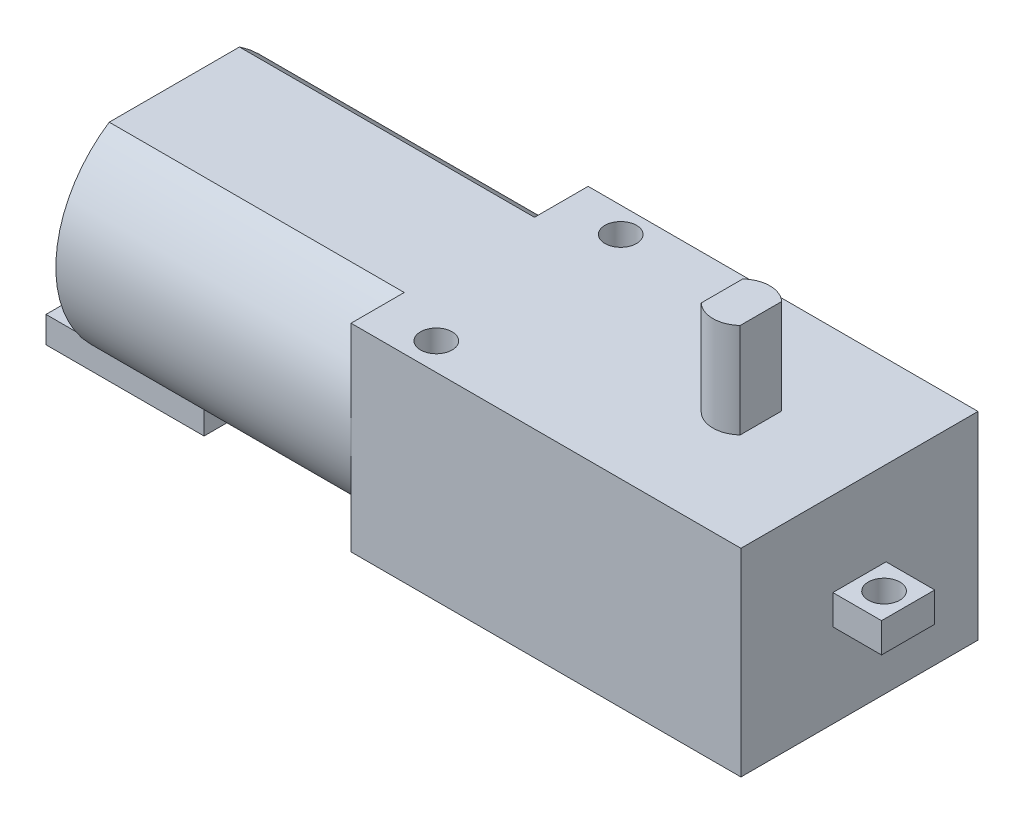
ISO-10303-21;
HEADER;
FILE_DESCRIPTION(('STEP AP214'),'2;1');
FILE_NAME('part.step','',(''),(''),'','','');
FILE_SCHEMA(('AUTOMOTIVE_DESIGN { 1 0 10303 214 1 1 1 1 }'));
ENDSEC;
DATA;
#1=APPLICATION_CONTEXT('core data for automotive mechanical design processes');
#2=APPLICATION_PROTOCOL_DEFINITION('international standard','automotive_design',2000,#1);
#3=PRODUCT_CONTEXT('',#1,'mechanical');
#4=PRODUCT('Part','Part','',(#3));
#5=PRODUCT_RELATED_PRODUCT_CATEGORY('part','',(#4));
#6=PRODUCT_DEFINITION_FORMATION('','',#4);
#7=PRODUCT_DEFINITION_CONTEXT('part definition',#1,'design');
#8=PRODUCT_DEFINITION('design','',#6,#7);
#9=PRODUCT_DEFINITION_SHAPE('','',#8);
#10=(LENGTH_UNIT() NAMED_UNIT(*) SI_UNIT(.MILLI.,.METRE.));
#11=(NAMED_UNIT(*) PLANE_ANGLE_UNIT() SI_UNIT($,.RADIAN.));
#12=(NAMED_UNIT(*) SI_UNIT($,.STERADIAN.) SOLID_ANGLE_UNIT());
#13=UNCERTAINTY_MEASURE_WITH_UNIT(LENGTH_MEASURE(1.E-05),#10,'distance_accuracy_value','');
#14=(GEOMETRIC_REPRESENTATION_CONTEXT(3) GLOBAL_UNCERTAINTY_ASSIGNED_CONTEXT((#13)) GLOBAL_UNIT_ASSIGNED_CONTEXT((#10,
#11,#12)) REPRESENTATION_CONTEXT('',''));
#15=CARTESIAN_POINT('',(0.,0.,0.));
#16=DIRECTION('',(0.,0.,1.));
#17=DIRECTION('',(1.,0.,0.));
#18=AXIS2_PLACEMENT_3D('',#15,#16,#17);
#19=CARTESIAN_POINT('',(0.,18.8,0.));
#20=DIRECTION('',(0.,-1.,0.));
#21=DIRECTION('',(0.,0.,-1.));
#22=AXIS2_PLACEMENT_3D('',#19,#20,#21);
#23=PLANE('',#22);
#24=CARTESIAN_POINT('',(5.5,18.8,-2.59256602208779));
#25=DIRECTION('',(0.,1.,0.));
#26=DIRECTION('',(0.,0.,1.));
#27=AXIS2_PLACEMENT_3D('',#24,#25,#26);
#28=CIRCLE('',#27,1.5);
#29=CARTESIAN_POINT('',(5.5,18.8,-1.09256602208779));
#30=VERTEX_POINT('',#29);
#31=EDGE_CURVE('E770',#30,#30,#28,.T.);
#32=ORIENTED_EDGE('',*,*,#31,.F.);
#33=EDGE_LOOP('',(#32));
#34=FACE_BOUND('',#33,.T.);
#35=CARTESIAN_POINT('',(5.5,18.8,-20.0925660220878));
#36=DIRECTION('',(0.,1.,0.));
#37=DIRECTION('',(0.,0.,1.));
#38=AXIS2_PLACEMENT_3D('',#35,#36,#37);
#39=CIRCLE('',#38,1.5);
#40=CARTESIAN_POINT('',(5.5,18.8,-18.5925660220878));
#41=VERTEX_POINT('',#40);
#42=EDGE_CURVE('E774',#41,#41,#39,.T.);
#43=ORIENTED_EDGE('',*,*,#42,.F.);
#44=EDGE_LOOP('',(#43));
#45=FACE_BOUND('',#44,.T.);
#46=DIRECTION('',(0.,0.,1.));
#47=VECTOR('',#46,1.);
#48=CARTESIAN_POINT('',(0.,18.8,0.));
#49=LINE('',#48,#47);
#50=CARTESIAN_POINT('',(0.,18.8,-22.5));
#51=VERTEX_POINT('',#50);
#52=CARTESIAN_POINT('',(0.,18.8,-17.4062662392968));
#53=VERTEX_POINT('',#52);
#54=EDGE_CURVE('E597',#51,#53,#49,.T.);
#55=ORIENTED_EDGE('',*,*,#54,.T.);
#56=DIRECTION('',(1.,0.,0.));
#57=VECTOR('',#56,1.);
#58=CARTESIAN_POINT('',(-28.,18.8,-17.4062662392968));
#59=LINE('',#58,#57);
#60=CARTESIAN_POINT('',(-28.,18.8,-17.4062662392968));
#61=VERTEX_POINT('',#60);
#62=EDGE_CURVE('E394',#61,#53,#59,.T.);
#63=ORIENTED_EDGE('',*,*,#62,.F.);
#64=DIRECTION('',(0.,0.,-1.));
#65=VECTOR('',#64,1.);
#66=CARTESIAN_POINT('',(-28.,18.8,-17.4062662392968));
#67=LINE('',#66,#65);
#68=CARTESIAN_POINT('',(-28.,18.8,-5.04784298893358));
#69=VERTEX_POINT('',#68);
#70=EDGE_CURVE('E392',#69,#61,#67,.T.);
#71=ORIENTED_EDGE('',*,*,#70,.F.);
#72=DIRECTION('',(1.,0.,0.));
#73=VECTOR('',#72,1.);
#74=CARTESIAN_POINT('',(-28.,18.8,-5.04784298893358));
#75=LINE('',#74,#73);
#76=CARTESIAN_POINT('',(0.,18.8,-5.04784298893358));
#77=VERTEX_POINT('',#76);
#78=EDGE_CURVE('E400',#69,#77,#75,.T.);
#79=ORIENTED_EDGE('',*,*,#78,.T.);
#80=CARTESIAN_POINT('',(0.,18.8,0.));
#81=VERTEX_POINT('',#80);
#82=EDGE_CURVE('E604',#77,#81,#49,.T.);
#83=ORIENTED_EDGE('',*,*,#82,.T.);
#84=DIRECTION('',(1.,0.,0.));
#85=VECTOR('',#84,1.);
#86=CARTESIAN_POINT('',(0.,18.8,0.));
#87=LINE('',#86,#85);
#88=CARTESIAN_POINT('',(37.,18.8,0.));
#89=VERTEX_POINT('',#88);
#90=EDGE_CURVE('E603',#81,#89,#87,.T.);
#91=ORIENTED_EDGE('',*,*,#90,.T.);
#92=DIRECTION('',(0.,0.,-1.));
#93=VECTOR('',#92,1.);
#94=CARTESIAN_POINT('',(37.,18.8,0.));
#95=LINE('',#94,#93);
#96=CARTESIAN_POINT('',(37.,18.8,-22.5));
#97=VERTEX_POINT('',#96);
#98=EDGE_CURVE('E606',#89,#97,#95,.T.);
#99=ORIENTED_EDGE('',*,*,#98,.T.);
#100=DIRECTION('',(-1.,0.,0.));
#101=VECTOR('',#100,1.);
#102=CARTESIAN_POINT('',(0.,18.8,-22.5));
#103=LINE('',#102,#101);
#104=EDGE_CURVE('E602',#97,#51,#103,.T.);
#105=ORIENTED_EDGE('',*,*,#104,.T.);
#106=EDGE_LOOP('',(#55,#63,#71,#79,#83,#91,#99,#105));
#107=FACE_BOUND('',#106,.T.);
#108=CARTESIAN_POINT('',(25.8,18.8,-11.25));
#109=DIRECTION('',(0.,1.,0.));
#110=DIRECTION('',(0.,0.,1.));
#111=AXIS2_PLACEMENT_3D('',#108,#109,#110);
#112=CIRCLE('',#111,2.69999999999999);
#113=CARTESIAN_POINT('',(23.95,18.8,-9.28340395607028));
#114=VERTEX_POINT('',#113);
#115=CARTESIAN_POINT('',(27.65,18.8,-9.28340395607029));
#116=VERTEX_POINT('',#115);
#117=EDGE_CURVE('E252',#114,#116,#112,.T.);
#118=ORIENTED_EDGE('',*,*,#117,.F.);
#119=DIRECTION('',(0.,0.,1.));
#120=VECTOR('',#119,1.);
#121=CARTESIAN_POINT('',(23.95,18.8,-9.28340395607028));
#122=LINE('',#121,#120);
#123=CARTESIAN_POINT('',(23.95,18.8,-13.2165960439297));
#124=VERTEX_POINT('',#123);
#125=EDGE_CURVE('E249',#124,#114,#122,.T.);
#126=ORIENTED_EDGE('',*,*,#125,.F.);
#127=CARTESIAN_POINT('',(25.8,18.8,-11.25));
#128=DIRECTION('',(0.,1.,0.));
#129=DIRECTION('',(0.,0.,1.));
#130=AXIS2_PLACEMENT_3D('',#127,#128,#129);
#131=CIRCLE('',#130,2.7);
#132=CARTESIAN_POINT('',(27.65,18.8,-13.2165960439297));
#133=VERTEX_POINT('',#132);
#134=EDGE_CURVE('E55',#133,#124,#131,.T.);
#135=ORIENTED_EDGE('',*,*,#134,.F.);
#136=DIRECTION('',(0.,0.,-1.));
#137=VECTOR('',#136,1.);
#138=CARTESIAN_POINT('',(27.65,18.8,-9.28340395607029));
#139=LINE('',#138,#137);
#140=EDGE_CURVE('E50',#116,#133,#139,.T.);
#141=ORIENTED_EDGE('',*,*,#140,.F.);
#142=EDGE_LOOP('',(#118,#126,#135,#141));
#143=FACE_BOUND('',#142,.T.);
#144=ADVANCED_FACE('F33',(#34,#45,#107,#143),#23,.F.);
#145=CARTESIAN_POINT('',(-34.,-2.5,-17.4062662392968));
#146=DIRECTION('',(1.,0.,0.));
#147=DIRECTION('',(0.,0.,-1.));
#148=AXIS2_PLACEMENT_3D('',#145,#146,#147);
#149=PLANE('',#148);
#150=DIRECTION('',(0.,0.,-1.));
#151=VECTOR('',#150,1.);
#152=CARTESIAN_POINT('',(-34.,0.,-17.4062662392968));
#153=LINE('',#152,#151);
#154=CARTESIAN_POINT('',(-34.,0.,-5.04784298893358));
#155=VERTEX_POINT('',#154);
#156=CARTESIAN_POINT('',(-34.,0.,-7.37231699099894));
#157=VERTEX_POINT('',#156);
#158=EDGE_CURVE('E331',#155,#157,#153,.T.);
#159=ORIENTED_EDGE('',*,*,#158,.T.);
#160=DIRECTION('',(0.,1.,0.));
#161=VECTOR('',#160,1.);
#162=CARTESIAN_POINT('',(-34.,-2.501,-7.37231699099894));
#163=LINE('',#162,#161);
#164=CARTESIAN_POINT('',(-34.,-2.5,-7.37231699099894));
#165=VERTEX_POINT('',#164);
#166=EDGE_CURVE('E272',#165,#157,#163,.T.);
#167=ORIENTED_EDGE('',*,*,#166,.F.);
#168=DIRECTION('',(0.,0.,-1.));
#169=VECTOR('',#168,1.);
#170=CARTESIAN_POINT('',(-34.,-2.5,-17.4062662392968));
#171=LINE('',#170,#169);
#172=CARTESIAN_POINT('',(-34.,-2.5,-5.04784298893358));
#173=VERTEX_POINT('',#172);
#174=EDGE_CURVE('E320',#173,#165,#171,.T.);
#175=ORIENTED_EDGE('',*,*,#174,.F.);
#176=DIRECTION('',(0.,1.,0.));
#177=VECTOR('',#176,1.);
#178=CARTESIAN_POINT('',(-34.,-2.5,-5.04784298893358));
#179=LINE('',#178,#177);
#180=EDGE_CURVE('E330',#173,#155,#179,.T.);
#181=ORIENTED_EDGE('',*,*,#180,.T.);
#182=EDGE_LOOP('',(#159,#167,#175,#181));
#183=FACE_BOUND('',#182,.T.);
#184=ADVANCED_FACE('F478',(#183),#149,.F.);
#185=CARTESIAN_POINT('',(0.,0.,0.));
#186=DIRECTION('',(0.,1.,0.));
#187=DIRECTION('',(0.,0.,1.));
#188=AXIS2_PLACEMENT_3D('',#185,#186,#187);
#189=PLANE('',#188);
#190=DIRECTION('',(1.,0.,0.));
#191=VECTOR('',#190,1.);
#192=CARTESIAN_POINT('',(-28.,0.,-7.37231699099894));
#193=LINE('',#192,#191);
#194=CARTESIAN_POINT('',(-28.,0.,-7.37231699099894));
#195=VERTEX_POINT('',#194);
#196=EDGE_CURVE('E265',#157,#195,#193,.T.);
#197=ORIENTED_EDGE('',*,*,#196,.F.);
#198=ORIENTED_EDGE('',*,*,#158,.F.);
#199=DIRECTION('',(-1.,0.,0.));
#200=VECTOR('',#199,1.);
#201=CARTESIAN_POINT('',(-34.,0.,-5.04784298893358));
#202=LINE('',#201,#200);
#203=CARTESIAN_POINT('',(-28.,0.,-5.04784298893358));
#204=VERTEX_POINT('',#203);
#205=EDGE_CURVE('E339',#204,#155,#202,.T.);
#206=ORIENTED_EDGE('',*,*,#205,.F.);
#207=DIRECTION('',(0.,0.,1.));
#208=VECTOR('',#207,1.);
#209=CARTESIAN_POINT('',(-28.,0.,-17.4062662392968));
#210=LINE('',#209,#208);
#211=EDGE_CURVE('E385',#195,#204,#210,.T.);
#212=ORIENTED_EDGE('',*,*,#211,.F.);
#213=EDGE_LOOP('',(#197,#198,#206,#212));
#214=FACE_BOUND('',#213,.T.);
#215=ADVANCED_FACE('F486',(#214),#189,.T.);
#216=CARTESIAN_POINT('',(37.,18.8,0.));
#217=DIRECTION('',(-1.,0.,0.));
#218=DIRECTION('',(0.,0.,1.));
#219=AXIS2_PLACEMENT_3D('',#216,#217,#218);
#220=PLANE('',#219);
#221=DIRECTION('',(0.,0.,-1.));
#222=VECTOR('',#221,1.);
#223=CARTESIAN_POINT('',(37.,0.,0.));
#224=LINE('',#223,#222);
#225=CARTESIAN_POINT('',(37.,0.,0.));
#226=VERTEX_POINT('',#225);
#227=CARTESIAN_POINT('',(37.,0.,-22.5));
#228=VERTEX_POINT('',#227);
#229=EDGE_CURVE('E510',#226,#228,#224,.T.);
#230=ORIENTED_EDGE('',*,*,#229,.T.);
#231=DIRECTION('',(0.,-1.,0.));
#232=VECTOR('',#231,1.);
#233=CARTESIAN_POINT('',(37.,18.8,-22.5));
#234=LINE('',#233,#232);
#235=EDGE_CURVE('E426',#97,#228,#234,.T.);
#236=ORIENTED_EDGE('',*,*,#235,.F.);
#237=ORIENTED_EDGE('',*,*,#98,.F.);
#238=DIRECTION('',(0.,-1.,0.));
#239=VECTOR('',#238,1.);
#240=CARTESIAN_POINT('',(37.,18.8,0.));
#241=LINE('',#240,#239);
#242=EDGE_CURVE('E438',#89,#226,#241,.T.);
#243=ORIENTED_EDGE('',*,*,#242,.T.);
#244=EDGE_LOOP('',(#230,#236,#237,#243));
#245=FACE_BOUND('',#244,.T.);
#246=DIRECTION('',(0.,-1.,0.));
#247=VECTOR('',#246,1.);
#248=CARTESIAN_POINT('',(37.,10.8,-8.725));
#249=LINE('',#248,#247);
#250=CARTESIAN_POINT('',(37.,10.8,-8.725));
#251=VERTEX_POINT('',#250);
#252=CARTESIAN_POINT('',(37.,7.98,-8.725));
#253=VERTEX_POINT('',#252);
#254=EDGE_CURVE('E286',#251,#253,#249,.T.);
#255=ORIENTED_EDGE('',*,*,#254,.F.);
#256=DIRECTION('',(0.,0.,1.));
#257=VECTOR('',#256,1.);
#258=CARTESIAN_POINT('',(37.,10.8,-8.725));
#259=LINE('',#258,#257);
#260=CARTESIAN_POINT('',(37.,10.8,-13.775));
#261=VERTEX_POINT('',#260);
#262=EDGE_CURVE('E291',#261,#251,#259,.T.);
#263=ORIENTED_EDGE('',*,*,#262,.F.);
#264=DIRECTION('',(0.,1.,0.));
#265=VECTOR('',#264,1.);
#266=CARTESIAN_POINT('',(37.,10.8,-13.775));
#267=LINE('',#266,#265);
#268=CARTESIAN_POINT('',(37.,7.98,-13.775));
#269=VERTEX_POINT('',#268);
#270=EDGE_CURVE('E303',#269,#261,#267,.T.);
#271=ORIENTED_EDGE('',*,*,#270,.F.);
#272=DIRECTION('',(0.,0.,-1.));
#273=VECTOR('',#272,1.);
#274=CARTESIAN_POINT('',(37.,7.98,-8.725));
#275=LINE('',#274,#273);
#276=EDGE_CURVE('E300',#253,#269,#275,.T.);
#277=ORIENTED_EDGE('',*,*,#276,.F.);
#278=EDGE_LOOP('',(#255,#263,#271,#277));
#279=FACE_BOUND('',#278,.T.);
#280=ADVANCED_FACE('F497',(#245,#279),#220,.F.);
#281=CARTESIAN_POINT('',(0.,0.,0.));
#282=DIRECTION('',(0.,-1.,0.));
#283=DIRECTION('',(0.,0.,-1.));
#284=AXIS2_PLACEMENT_3D('',#281,#282,#283);
#285=PLANE('',#284);
#286=CARTESIAN_POINT('',(5.5,0.,-2.59256602208779));
#287=DIRECTION('',(0.,-1.,0.));
#288=DIRECTION('',(0.,0.,-1.));
#289=AXIS2_PLACEMENT_3D('',#286,#287,#288);
#290=CIRCLE('',#289,1.5);
#291=CARTESIAN_POINT('',(5.5,0.,-4.09256602208779));
#292=VERTEX_POINT('',#291);
#293=EDGE_CURVE('E768',#292,#292,#290,.F.);
#294=ORIENTED_EDGE('',*,*,#293,.T.);
#295=EDGE_LOOP('',(#294));
#296=FACE_BOUND('',#295,.T.);
#297=CARTESIAN_POINT('',(5.5,0.,-20.0925660220878));
#298=DIRECTION('',(0.,-1.,0.));
#299=DIRECTION('',(0.,0.,-1.));
#300=AXIS2_PLACEMENT_3D('',#297,#298,#299);
#301=CIRCLE('',#300,1.5);
#302=CARTESIAN_POINT('',(5.5,0.,-21.5925660220878));
#303=VERTEX_POINT('',#302);
#304=EDGE_CURVE('E771',#303,#303,#301,.F.);
#305=ORIENTED_EDGE('',*,*,#304,.T.);
#306=EDGE_LOOP('',(#305));
#307=FACE_BOUND('',#306,.T.);
#308=DIRECTION('',(-1.,0.,0.));
#309=VECTOR('',#308,1.);
#310=CARTESIAN_POINT('',(-4.77118554919526,0.,-8.65626623929682));
#311=LINE('',#310,#309);
#312=CARTESIAN_POINT('',(-4.77118554919526,0.,-8.65626623929682));
#313=VERTEX_POINT('',#312);
#314=CARTESIAN_POINT('',(-8.27118554919526,0.,-8.65626623929682));
#315=VERTEX_POINT('',#314);
#316=EDGE_CURVE('E366',#313,#315,#311,.T.);
#317=ORIENTED_EDGE('',*,*,#316,.F.);
#318=DIRECTION('',(0.,0.,1.));
#319=VECTOR('',#318,1.);
#320=CARTESIAN_POINT('',(-4.77118554919526,0.,-13.8062662392968));
#321=LINE('',#320,#319);
#322=CARTESIAN_POINT('',(-4.77118554919526,0.,-13.8062662392968));
#323=VERTEX_POINT('',#322);
#324=EDGE_CURVE('E352',#323,#313,#321,.T.);
#325=ORIENTED_EDGE('',*,*,#324,.F.);
#326=DIRECTION('',(1.,0.,0.));
#327=VECTOR('',#326,1.);
#328=CARTESIAN_POINT('',(-4.77118554919526,0.,-13.8062662392968));
#329=LINE('',#328,#327);
#330=CARTESIAN_POINT('',(-8.27118554919526,0.,-13.8062662392968));
#331=VERTEX_POINT('',#330);
#332=EDGE_CURVE('E357',#331,#323,#329,.T.);
#333=ORIENTED_EDGE('',*,*,#332,.F.);
#334=DIRECTION('',(0.,0.,-1.));
#335=VECTOR('',#334,1.);
#336=CARTESIAN_POINT('',(-8.27118554919526,0.,-13.8062662392968));
#337=LINE('',#336,#335);
#338=EDGE_CURVE('E368',#315,#331,#337,.T.);
#339=ORIENTED_EDGE('',*,*,#338,.F.);
#340=EDGE_LOOP('',(#317,#325,#333,#339));
#341=FACE_BOUND('',#340,.T.);
#342=DIRECTION('',(1.,0.,0.));
#343=VECTOR('',#342,1.);
#344=CARTESIAN_POINT('',(-28.,0.,-5.04784298893358));
#345=LINE('',#344,#343);
#346=CARTESIAN_POINT('',(-19.,0.,-5.04784298893358));
#347=VERTEX_POINT('',#346);
#348=CARTESIAN_POINT('',(0.,0.,-5.04784298893358));
#349=VERTEX_POINT('',#348);
#350=EDGE_CURVE('E403',#347,#349,#345,.T.);
#351=ORIENTED_EDGE('',*,*,#350,.F.);
#352=DIRECTION('',(0.,0.,1.));
#353=VECTOR('',#352,1.);
#354=CARTESIAN_POINT('',(-19.,0.,-17.4062662392968));
#355=LINE('',#354,#353);
#356=CARTESIAN_POINT('',(-19.,0.,-17.4062662392968));
#357=VERTEX_POINT('',#356);
#358=EDGE_CURVE('E337',#357,#347,#355,.T.);
#359=ORIENTED_EDGE('',*,*,#358,.F.);
#360=DIRECTION('',(1.,0.,0.));
#361=VECTOR('',#360,1.);
#362=CARTESIAN_POINT('',(-28.,0.,-17.4062662392968));
#363=LINE('',#362,#361);
#364=CARTESIAN_POINT('',(0.,0.,-17.4062662392968));
#365=VERTEX_POINT('',#364);
#366=EDGE_CURVE('E407',#357,#365,#363,.T.);
#367=ORIENTED_EDGE('',*,*,#366,.T.);
#368=DIRECTION('',(0.,0.,1.));
#369=VECTOR('',#368,1.);
#370=CARTESIAN_POINT('',(0.,0.,0.));
#371=LINE('',#370,#369);
#372=CARTESIAN_POINT('',(0.,0.,-22.5));
#373=VERTEX_POINT('',#372);
#374=EDGE_CURVE('E613',#373,#365,#371,.T.);
#375=ORIENTED_EDGE('',*,*,#374,.F.);
#376=DIRECTION('',(-1.,0.,0.));
#377=VECTOR('',#376,1.);
#378=CARTESIAN_POINT('',(0.,0.,-22.5));
#379=LINE('',#378,#377);
#380=EDGE_CURVE('E434',#228,#373,#379,.T.);
#381=ORIENTED_EDGE('',*,*,#380,.F.);
#382=ORIENTED_EDGE('',*,*,#229,.F.);
#383=DIRECTION('',(1.,0.,0.));
#384=VECTOR('',#383,1.);
#385=CARTESIAN_POINT('',(0.,0.,0.));
#386=LINE('',#385,#384);
#387=CARTESIAN_POINT('',(0.,0.,0.));
#388=VERTEX_POINT('',#387);
#389=EDGE_CURVE('E464',#388,#226,#386,.T.);
#390=ORIENTED_EDGE('',*,*,#389,.F.);
#391=EDGE_CURVE('E410',#349,#388,#371,.T.);
#392=ORIENTED_EDGE('',*,*,#391,.F.);
#393=EDGE_LOOP('',(#351,#359,#367,#375,#381,#382,#390,#392));
#394=FACE_BOUND('',#393,.T.);
#395=ADVANCED_FACE('F496',(#296,#307,#341,#394),#285,.T.);
#396=CARTESIAN_POINT('',(0.,18.8,0.));
#397=DIRECTION('',(1.,0.,0.));
#398=DIRECTION('',(0.,0.,-1.));
#399=AXIS2_PLACEMENT_3D('',#396,#397,#398);
#400=PLANE('',#399);
#401=CARTESIAN_POINT('',(0.,9.4,-11.2875756079147));
#402=DIRECTION('',(-1.,0.,0.));
#403=DIRECTION('',(0.,0.,1.));
#404=AXIS2_PLACEMENT_3D('',#401,#402,#403);
#405=CIRCLE('',#404,11.2159874751429);
#406=CARTESIAN_POINT('',(0.,9.682691164231,-22.5));
#407=VERTEX_POINT('',#406);
#408=EDGE_CURVE('E381',#53,#407,#405,.T.);
#409=ORIENTED_EDGE('',*,*,#408,.F.);
#410=ORIENTED_EDGE('',*,*,#54,.F.);
#411=DIRECTION('',(0.,-1.,0.));
#412=VECTOR('',#411,1.);
#413=CARTESIAN_POINT('',(0.,18.8,-22.5));
#414=LINE('',#413,#412);
#415=EDGE_CURVE('E424',#51,#407,#414,.T.);
#416=ORIENTED_EDGE('',*,*,#415,.T.);
#417=EDGE_LOOP('',(#409,#410,#416));
#418=FACE_BOUND('',#417,.T.);
#419=ADVANCED_FACE('F475',(#418),#400,.F.);
#420=CARTESIAN_POINT('',(0.,9.117308835769,-22.5));
#421=VERTEX_POINT('',#420);
#422=EDGE_CURVE('E11',#421,#365,#405,.T.);
#423=ORIENTED_EDGE('',*,*,#422,.F.);
#424=EDGE_CURVE('E37',#421,#373,#414,.T.);
#425=ORIENTED_EDGE('',*,*,#424,.T.);
#426=ORIENTED_EDGE('',*,*,#374,.T.);
#427=EDGE_LOOP('',(#423,#425,#426));
#428=FACE_BOUND('',#427,.T.);
#429=ADVANCED_FACE('F625',(#428),#400,.F.);
#430=CARTESIAN_POINT('',(0.,9.4,-11.233156749871));
#431=DIRECTION('',(-1.,0.,0.));
#432=DIRECTION('',(0.,0.,-1.));
#433=AXIS2_PLACEMENT_3D('',#430,#431,#432);
#434=CIRCLE('',#433,11.252471120658);
#435=CARTESIAN_POINT('',(0.,8.74098880580881,0.));
#436=VERTEX_POINT('',#435);
#437=EDGE_CURVE('E386',#349,#436,#434,.T.);
#438=ORIENTED_EDGE('',*,*,#437,.F.);
#439=ORIENTED_EDGE('',*,*,#391,.T.);
#440=DIRECTION('',(0.,-1.,0.));
#441=VECTOR('',#440,1.);
#442=CARTESIAN_POINT('',(0.,18.8,0.));
#443=LINE('',#442,#441);
#444=EDGE_CURVE('E440',#436,#388,#443,.T.);
#445=ORIENTED_EDGE('',*,*,#444,.F.);
#446=EDGE_LOOP('',(#438,#439,#445));
#447=FACE_BOUND('',#446,.T.);
#448=ADVANCED_FACE('F473',(#447),#400,.F.);
#449=CARTESIAN_POINT('',(0.,10.0590111941912,0.));
#450=VERTEX_POINT('',#449);
#451=EDGE_CURVE('E43',#450,#77,#434,.T.);
#452=ORIENTED_EDGE('',*,*,#451,.F.);
#453=EDGE_CURVE('E419',#81,#450,#443,.T.);
#454=ORIENTED_EDGE('',*,*,#453,.F.);
#455=ORIENTED_EDGE('',*,*,#82,.F.);
#456=EDGE_LOOP('',(#452,#454,#455));
#457=FACE_BOUND('',#456,.T.);
#458=ADVANCED_FACE('F35',(#457),#400,.F.);
#459=CARTESIAN_POINT('',(0.,18.8,0.));
#460=DIRECTION('',(0.,0.,-1.));
#461=DIRECTION('',(-1.,0.,0.));
#462=AXIS2_PLACEMENT_3D('',#459,#460,#461);
#463=PLANE('',#462);
#464=ORIENTED_EDGE('',*,*,#389,.T.);
#465=ORIENTED_EDGE('',*,*,#242,.F.);
#466=ORIENTED_EDGE('',*,*,#90,.F.);
#467=ORIENTED_EDGE('',*,*,#453,.T.);
#468=EDGE_CURVE('E445',#450,#436,#443,.T.);
#469=ORIENTED_EDGE('',*,*,#468,.T.);
#470=ORIENTED_EDGE('',*,*,#444,.T.);
#471=EDGE_LOOP('',(#464,#465,#466,#467,#469,#470));
#472=FACE_BOUND('',#471,.T.);
#473=ADVANCED_FACE('F462',(#472),#463,.F.);
#474=CARTESIAN_POINT('',(0.,18.8,-22.5));
#475=DIRECTION('',(0.,0.,1.));
#476=DIRECTION('',(1.,0.,0.));
#477=AXIS2_PLACEMENT_3D('',#474,#475,#476);
#478=PLANE('',#477);
#479=ORIENTED_EDGE('',*,*,#380,.T.);
#480=ORIENTED_EDGE('',*,*,#424,.F.);
#481=CARTESIAN_POINT('',(0.,9.4,-11.2875756079147));
#482=DIRECTION('',(-1.,0.,0.));
#483=DIRECTION('',(0.,0.0252043045569997,-0.999682321055943));
#484=AXIS2_PLACEMENT_3D('',#481,#482,#483);
#485=CIRCLE('',#484,11.2159874751429);
#486=EDGE_CURVE('E427',#407,#421,#485,.T.);
#487=ORIENTED_EDGE('',*,*,#486,.F.);
#488=ORIENTED_EDGE('',*,*,#415,.F.);
#489=ORIENTED_EDGE('',*,*,#104,.F.);
#490=ORIENTED_EDGE('',*,*,#235,.T.);
#491=EDGE_LOOP('',(#479,#480,#487,#488,#489,#490));
#492=FACE_BOUND('',#491,.T.);
#493=ADVANCED_FACE('F466',(#492),#478,.F.);
#494=CARTESIAN_POINT('',(-28.,9.4,-11.2875756079147));
#495=DIRECTION('',(1.,0.,0.));
#496=DIRECTION('',(0.,0.,-1.));
#497=AXIS2_PLACEMENT_3D('',#494,#495,#496);
#498=CYLINDRICAL_SURFACE('',#497,11.2159874751429);
#499=ORIENTED_EDGE('',*,*,#408,.T.);
#500=ORIENTED_EDGE('',*,*,#486,.T.);
#501=ORIENTED_EDGE('',*,*,#422,.T.);
#502=ORIENTED_EDGE('',*,*,#366,.F.);
#503=CARTESIAN_POINT('',(-28.,0.,-17.4062662392968));
#504=VERTEX_POINT('',#503);
#505=EDGE_CURVE('E408',#504,#357,#363,.T.);
#506=ORIENTED_EDGE('',*,*,#505,.F.);
#507=CARTESIAN_POINT('',(-28.,9.4,-11.2875756079147));
#508=DIRECTION('',(-1.,0.,0.));
#509=DIRECTION('',(0.,0.,1.));
#510=AXIS2_PLACEMENT_3D('',#507,#508,#509);
#511=CIRCLE('',#510,11.2159874751429);
#512=EDGE_CURVE('E382',#61,#504,#511,.T.);
#513=ORIENTED_EDGE('',*,*,#512,.F.);
#514=ORIENTED_EDGE('',*,*,#62,.T.);
#515=EDGE_LOOP('',(#499,#500,#501,#502,#506,#513,#514));
#516=FACE_BOUND('',#515,.T.);
#517=ADVANCED_FACE('F471',(#516),#498,.T.);
#518=CARTESIAN_POINT('',(-28.,9.4,-11.233156749871));
#519=DIRECTION('',(1.,0.,0.));
#520=DIRECTION('',(0.,0.,-1.));
#521=AXIS2_PLACEMENT_3D('',#518,#519,#520);
#522=CYLINDRICAL_SURFACE('',#521,11.252471120658);
#523=ORIENTED_EDGE('',*,*,#437,.T.);
#524=EDGE_CURVE('E397',#436,#450,#434,.T.);
#525=ORIENTED_EDGE('',*,*,#524,.T.);
#526=ORIENTED_EDGE('',*,*,#451,.T.);
#527=ORIENTED_EDGE('',*,*,#78,.F.);
#528=CARTESIAN_POINT('',(-28.,9.4,-11.233156749871));
#529=DIRECTION('',(-1.,0.,0.));
#530=DIRECTION('',(0.,0.,-1.));
#531=AXIS2_PLACEMENT_3D('',#528,#529,#530);
#532=CIRCLE('',#531,11.252471120658);
#533=EDGE_CURVE('E390',#204,#69,#532,.T.);
#534=ORIENTED_EDGE('',*,*,#533,.F.);
#535=EDGE_CURVE('E404',#204,#347,#345,.T.);
#536=ORIENTED_EDGE('',*,*,#535,.T.);
#537=ORIENTED_EDGE('',*,*,#350,.T.);
#538=EDGE_LOOP('',(#523,#525,#526,#527,#534,#536,#537));
#539=FACE_BOUND('',#538,.T.);
#540=ADVANCED_FACE('F458',(#539),#522,.T.);
#541=CARTESIAN_POINT('',(-28.,9.4,-11.2875756079147));
#542=DIRECTION('',(-1.,0.,0.));
#543=DIRECTION('',(0.,0.,1.));
#544=AXIS2_PLACEMENT_3D('',#541,#542,#543);
#545=PLANE('',#544);
#546=ORIENTED_EDGE('',*,*,#512,.T.);
#547=CARTESIAN_POINT('',(-28.,0.,-14.8697728922933));
#548=VERTEX_POINT('',#547);
#549=EDGE_CURVE('E387',#504,#548,#210,.T.);
#550=ORIENTED_EDGE('',*,*,#549,.T.);
#551=DIRECTION('',(0.,1.,0.));
#552=VECTOR('',#551,1.);
#553=CARTESIAN_POINT('',(-28.,-2.501,-14.8697728922933));
#554=LINE('',#553,#552);
#555=CARTESIAN_POINT('',(-28.,-2.5,-14.8697728922933));
#556=VERTEX_POINT('',#555);
#557=EDGE_CURVE('E268',#556,#548,#554,.T.);
#558=ORIENTED_EDGE('',*,*,#557,.F.);
#559=DIRECTION('',(0.,0.,1.));
#560=VECTOR('',#559,1.);
#561=CARTESIAN_POINT('',(-28.,-2.5,-14.8697728922933));
#562=LINE('',#561,#560);
#563=CARTESIAN_POINT('',(-28.,-2.5,-7.37231699099894));
#564=VERTEX_POINT('',#563);
#565=EDGE_CURVE('E253',#556,#564,#562,.T.);
#566=ORIENTED_EDGE('',*,*,#565,.T.);
#567=DIRECTION('',(0.,1.,0.));
#568=VECTOR('',#567,1.);
#569=CARTESIAN_POINT('',(-28.,-2.501,-7.37231699099894));
#570=LINE('',#569,#568);
#571=EDGE_CURVE('E269',#564,#195,#570,.T.);
#572=ORIENTED_EDGE('',*,*,#571,.T.);
#573=ORIENTED_EDGE('',*,*,#211,.T.);
#574=ORIENTED_EDGE('',*,*,#533,.T.);
#575=ORIENTED_EDGE('',*,*,#70,.T.);
#576=EDGE_LOOP('',(#546,#550,#558,#566,#572,#573,#574,#575));
#577=FACE_BOUND('',#576,.T.);
#578=ADVANCED_FACE('F580',(#577),#545,.T.);
#579=CARTESIAN_POINT('',(0.,9.4,-11.2875756079147));
#580=DIRECTION('',(-1.,0.,0.));
#581=DIRECTION('',(0.,0.,1.));
#582=AXIS2_PLACEMENT_3D('',#579,#580,#581);
#583=PLANE('',#582);
#584=ORIENTED_EDGE('',*,*,#468,.F.);
#585=ORIENTED_EDGE('',*,*,#524,.F.);
#586=EDGE_LOOP('',(#584,#585));
#587=FACE_BOUND('',#586,.T.);
#588=ADVANCED_FACE('F461',(#587),#583,.F.);
#589=CARTESIAN_POINT('',(-4.77118554919526,-2.5,-13.8062662392968));
#590=DIRECTION('',(-1.,0.,0.));
#591=DIRECTION('',(0.,0.,1.));
#592=AXIS2_PLACEMENT_3D('',#589,#590,#591);
#593=PLANE('',#592);
#594=ORIENTED_EDGE('',*,*,#324,.T.);
#595=DIRECTION('',(0.,1.,0.));
#596=VECTOR('',#595,1.);
#597=CARTESIAN_POINT('',(-4.77118554919526,-2.5,-8.65626623929682));
#598=LINE('',#597,#596);
#599=CARTESIAN_POINT('',(-4.77118554919526,-2.5,-8.65626623929682));
#600=VERTEX_POINT('',#599);
#601=EDGE_CURVE('E379',#600,#313,#598,.T.);
#602=ORIENTED_EDGE('',*,*,#601,.F.);
#603=DIRECTION('',(0.,0.,1.));
#604=VECTOR('',#603,1.);
#605=CARTESIAN_POINT('',(-4.77118554919526,-2.5,-13.8062662392968));
#606=LINE('',#605,#604);
#607=CARTESIAN_POINT('',(-4.77118554919526,-2.5,-13.8062662392968));
#608=VERTEX_POINT('',#607);
#609=EDGE_CURVE('E353',#608,#600,#606,.T.);
#610=ORIENTED_EDGE('',*,*,#609,.F.);
#611=DIRECTION('',(0.,1.,0.));
#612=VECTOR('',#611,1.);
#613=CARTESIAN_POINT('',(-4.77118554919526,-2.5,-13.8062662392968));
#614=LINE('',#613,#612);
#615=EDGE_CURVE('E363',#608,#323,#614,.T.);
#616=ORIENTED_EDGE('',*,*,#615,.T.);
#617=EDGE_LOOP('',(#594,#602,#610,#616));
#618=FACE_BOUND('',#617,.T.);
#619=ADVANCED_FACE('F575',(#618),#593,.F.);
#620=CARTESIAN_POINT('',(-4.77118554919526,-2.5,-8.65626623929682));
#621=DIRECTION('',(0.,0.,-1.));
#622=DIRECTION('',(-1.,0.,0.));
#623=AXIS2_PLACEMENT_3D('',#620,#621,#622);
#624=PLANE('',#623);
#625=ORIENTED_EDGE('',*,*,#316,.T.);
#626=DIRECTION('',(0.,1.,0.));
#627=VECTOR('',#626,1.);
#628=CARTESIAN_POINT('',(-8.27118554919526,-2.5,-8.65626623929682));
#629=LINE('',#628,#627);
#630=CARTESIAN_POINT('',(-8.27118554919526,-2.5,-8.65626623929682));
#631=VERTEX_POINT('',#630);
#632=EDGE_CURVE('E376',#631,#315,#629,.T.);
#633=ORIENTED_EDGE('',*,*,#632,.F.);
#634=DIRECTION('',(-1.,0.,0.));
#635=VECTOR('',#634,1.);
#636=CARTESIAN_POINT('',(-4.77118554919526,-2.5,-8.65626623929682));
#637=LINE('',#636,#635);
#638=EDGE_CURVE('E356',#600,#631,#637,.T.);
#639=ORIENTED_EDGE('',*,*,#638,.F.);
#640=ORIENTED_EDGE('',*,*,#601,.T.);
#641=EDGE_LOOP('',(#625,#633,#639,#640));
#642=FACE_BOUND('',#641,.T.);
#643=ADVANCED_FACE('F571',(#642),#624,.F.);
#644=CARTESIAN_POINT('',(-8.27118554919526,-2.5,-13.8062662392968));
#645=DIRECTION('',(1.,0.,0.));
#646=DIRECTION('',(0.,0.,-1.));
#647=AXIS2_PLACEMENT_3D('',#644,#645,#646);
#648=PLANE('',#647);
#649=ORIENTED_EDGE('',*,*,#338,.T.);
#650=DIRECTION('',(0.,1.,0.));
#651=VECTOR('',#650,1.);
#652=CARTESIAN_POINT('',(-8.27118554919526,-2.5,-13.8062662392968));
#653=LINE('',#652,#651);
#654=CARTESIAN_POINT('',(-8.27118554919526,-2.5,-13.8062662392968));
#655=VERTEX_POINT('',#654);
#656=EDGE_CURVE('E374',#655,#331,#653,.T.);
#657=ORIENTED_EDGE('',*,*,#656,.F.);
#658=DIRECTION('',(0.,0.,-1.));
#659=VECTOR('',#658,1.);
#660=CARTESIAN_POINT('',(-8.27118554919526,-2.5,-13.8062662392968));
#661=LINE('',#660,#659);
#662=EDGE_CURVE('E359',#631,#655,#661,.T.);
#663=ORIENTED_EDGE('',*,*,#662,.F.);
#664=ORIENTED_EDGE('',*,*,#632,.T.);
#665=EDGE_LOOP('',(#649,#657,#663,#664));
#666=FACE_BOUND('',#665,.T.);
#667=ADVANCED_FACE('F567',(#666),#648,.F.);
#668=CARTESIAN_POINT('',(-4.77118554919526,-2.5,-13.8062662392968));
#669=DIRECTION('',(0.,0.,1.));
#670=DIRECTION('',(1.,0.,0.));
#671=AXIS2_PLACEMENT_3D('',#668,#669,#670);
#672=PLANE('',#671);
#673=ORIENTED_EDGE('',*,*,#332,.T.);
#674=ORIENTED_EDGE('',*,*,#615,.F.);
#675=DIRECTION('',(1.,0.,0.));
#676=VECTOR('',#675,1.);
#677=CARTESIAN_POINT('',(-4.77118554919526,-2.5,-13.8062662392968));
#678=LINE('',#677,#676);
#679=EDGE_CURVE('E361',#655,#608,#678,.T.);
#680=ORIENTED_EDGE('',*,*,#679,.F.);
#681=ORIENTED_EDGE('',*,*,#656,.T.);
#682=EDGE_LOOP('',(#673,#674,#680,#681));
#683=FACE_BOUND('',#682,.T.);
#684=ADVANCED_FACE('F563',(#683),#672,.F.);
#685=CARTESIAN_POINT('',(0.,-2.5,0.));
#686=DIRECTION('',(0.,-1.,0.));
#687=DIRECTION('',(0.,0.,-1.));
#688=AXIS2_PLACEMENT_3D('',#685,#686,#687);
#689=PLANE('',#688);
#690=ORIENTED_EDGE('',*,*,#609,.T.);
#691=ORIENTED_EDGE('',*,*,#638,.T.);
#692=ORIENTED_EDGE('',*,*,#662,.T.);
#693=ORIENTED_EDGE('',*,*,#679,.T.);
#694=EDGE_LOOP('',(#690,#691,#692,#693));
#695=FACE_BOUND('',#694,.T.);
#696=ADVANCED_FACE('F559',(#695),#689,.T.);
#697=CARTESIAN_POINT('',(-34.,-2.5,-14.8697728922933));
#698=VERTEX_POINT('',#697);
#699=CARTESIAN_POINT('',(-34.,-2.5,-17.4062662392968));
#700=VERTEX_POINT('',#699);
#701=EDGE_CURVE('E324',#698,#700,#171,.T.);
#702=ORIENTED_EDGE('',*,*,#701,.F.);
#703=DIRECTION('',(0.,1.,0.));
#704=VECTOR('',#703,1.);
#705=CARTESIAN_POINT('',(-34.,-2.501,-14.8697728922933));
#706=LINE('',#705,#704);
#707=CARTESIAN_POINT('',(-34.,0.,-14.8697728922933));
#708=VERTEX_POINT('',#707);
#709=EDGE_CURVE('E274',#698,#708,#706,.T.);
#710=ORIENTED_EDGE('',*,*,#709,.T.);
#711=CARTESIAN_POINT('',(-34.,0.,-17.4062662392968));
#712=VERTEX_POINT('',#711);
#713=EDGE_CURVE('E319',#708,#712,#153,.T.);
#714=ORIENTED_EDGE('',*,*,#713,.T.);
#715=DIRECTION('',(0.,1.,0.));
#716=VECTOR('',#715,1.);
#717=CARTESIAN_POINT('',(-34.,-2.5,-17.4062662392968));
#718=LINE('',#717,#716);
#719=EDGE_CURVE('E349',#700,#712,#718,.T.);
#720=ORIENTED_EDGE('',*,*,#719,.F.);
#721=EDGE_LOOP('',(#702,#710,#714,#720));
#722=FACE_BOUND('',#721,.T.);
#723=ADVANCED_FACE('F489',(#722),#149,.F.);
#724=CARTESIAN_POINT('',(-34.,-2.5,-17.4062662392968));
#725=DIRECTION('',(0.,0.,1.));
#726=DIRECTION('',(1.,0.,0.));
#727=AXIS2_PLACEMENT_3D('',#724,#725,#726);
#728=PLANE('',#727);
#729=DIRECTION('',(1.,0.,0.));
#730=VECTOR('',#729,1.);
#731=CARTESIAN_POINT('',(-34.,0.,-17.4062662392968));
#732=LINE('',#731,#730);
#733=EDGE_CURVE('E334',#712,#504,#732,.T.);
#734=ORIENTED_EDGE('',*,*,#733,.T.);
#735=ORIENTED_EDGE('',*,*,#505,.T.);
#736=DIRECTION('',(0.,1.,0.));
#737=VECTOR('',#736,1.);
#738=CARTESIAN_POINT('',(-19.,-2.5,-17.4062662392968));
#739=LINE('',#738,#737);
#740=CARTESIAN_POINT('',(-19.,-2.5,-17.4062662392968));
#741=VERTEX_POINT('',#740);
#742=EDGE_CURVE('E346',#741,#357,#739,.T.);
#743=ORIENTED_EDGE('',*,*,#742,.F.);
#744=DIRECTION('',(1.,0.,0.));
#745=VECTOR('',#744,1.);
#746=CARTESIAN_POINT('',(-34.,-2.5,-17.4062662392968));
#747=LINE('',#746,#745);
#748=EDGE_CURVE('E323',#700,#741,#747,.T.);
#749=ORIENTED_EDGE('',*,*,#748,.F.);
#750=ORIENTED_EDGE('',*,*,#719,.T.);
#751=EDGE_LOOP('',(#734,#735,#743,#749,#750));
#752=FACE_BOUND('',#751,.T.);
#753=ADVANCED_FACE('F553',(#752),#728,.F.);
#754=CARTESIAN_POINT('',(-19.,-2.5,-17.4062662392968));
#755=DIRECTION('',(-1.,0.,0.));
#756=DIRECTION('',(0.,0.,1.));
#757=AXIS2_PLACEMENT_3D('',#754,#755,#756);
#758=PLANE('',#757);
#759=ORIENTED_EDGE('',*,*,#358,.T.);
#760=DIRECTION('',(0.,1.,0.));
#761=VECTOR('',#760,1.);
#762=CARTESIAN_POINT('',(-19.,-2.5,-5.04784298893358));
#763=LINE('',#762,#761);
#764=CARTESIAN_POINT('',(-19.,-2.5,-5.04784298893358));
#765=VERTEX_POINT('',#764);
#766=EDGE_CURVE('E343',#765,#347,#763,.T.);
#767=ORIENTED_EDGE('',*,*,#766,.F.);
#768=DIRECTION('',(0.,0.,1.));
#769=VECTOR('',#768,1.);
#770=CARTESIAN_POINT('',(-19.,-2.5,-17.4062662392968));
#771=LINE('',#770,#769);
#772=EDGE_CURVE('E326',#741,#765,#771,.T.);
#773=ORIENTED_EDGE('',*,*,#772,.F.);
#774=ORIENTED_EDGE('',*,*,#742,.T.);
#775=EDGE_LOOP('',(#759,#767,#773,#774));
#776=FACE_BOUND('',#775,.T.);
#777=ADVANCED_FACE('F549',(#776),#758,.F.);
#778=CARTESIAN_POINT('',(-34.,-2.5,-5.04784298893358));
#779=DIRECTION('',(0.,0.,-1.));
#780=DIRECTION('',(-1.,0.,0.));
#781=AXIS2_PLACEMENT_3D('',#778,#779,#780);
#782=PLANE('',#781);
#783=ORIENTED_EDGE('',*,*,#535,.F.);
#784=ORIENTED_EDGE('',*,*,#205,.T.);
#785=ORIENTED_EDGE('',*,*,#180,.F.);
#786=DIRECTION('',(-1.,0.,0.));
#787=VECTOR('',#786,1.);
#788=CARTESIAN_POINT('',(-34.,-2.5,-5.04784298893358));
#789=LINE('',#788,#787);
#790=EDGE_CURVE('E328',#765,#173,#789,.T.);
#791=ORIENTED_EDGE('',*,*,#790,.F.);
#792=ORIENTED_EDGE('',*,*,#766,.T.);
#793=EDGE_LOOP('',(#783,#784,#785,#791,#792));
#794=FACE_BOUND('',#793,.T.);
#795=ADVANCED_FACE('F542',(#794),#782,.F.);
#796=CARTESIAN_POINT('',(0.,-2.5,0.));
#797=DIRECTION('',(0.,1.,0.));
#798=DIRECTION('',(0.,0.,1.));
#799=AXIS2_PLACEMENT_3D('',#796,#797,#798);
#800=PLANE('',#799);
#801=ORIENTED_EDGE('',*,*,#174,.T.);
#802=DIRECTION('',(-1.,0.,0.));
#803=VECTOR('',#802,1.);
#804=CARTESIAN_POINT('',(-28.,-2.5,-7.37231699099894));
#805=LINE('',#804,#803);
#806=EDGE_CURVE('E256',#564,#165,#805,.T.);
#807=ORIENTED_EDGE('',*,*,#806,.F.);
#808=ORIENTED_EDGE('',*,*,#565,.F.);
#809=DIRECTION('',(1.,0.,0.));
#810=VECTOR('',#809,1.);
#811=CARTESIAN_POINT('',(-28.,-2.5,-14.8697728922933));
#812=LINE('',#811,#810);
#813=EDGE_CURVE('E271',#698,#556,#812,.T.);
#814=ORIENTED_EDGE('',*,*,#813,.F.);
#815=ORIENTED_EDGE('',*,*,#701,.T.);
#816=ORIENTED_EDGE('',*,*,#748,.T.);
#817=ORIENTED_EDGE('',*,*,#772,.T.);
#818=ORIENTED_EDGE('',*,*,#790,.T.);
#819=EDGE_LOOP('',(#801,#807,#808,#814,#815,#816,#817,#818));
#820=FACE_BOUND('',#819,.T.);
#821=ADVANCED_FACE('F540',(#820),#800,.F.);
#822=DIRECTION('',(-1.,0.,0.));
#823=VECTOR('',#822,1.);
#824=CARTESIAN_POINT('',(-28.,0.,-14.8697728922933));
#825=LINE('',#824,#823);
#826=EDGE_CURVE('E263',#548,#708,#825,.T.);
#827=ORIENTED_EDGE('',*,*,#826,.F.);
#828=ORIENTED_EDGE('',*,*,#549,.F.);
#829=ORIENTED_EDGE('',*,*,#733,.F.);
#830=ORIENTED_EDGE('',*,*,#713,.F.);
#831=EDGE_LOOP('',(#827,#828,#829,#830));
#832=FACE_BOUND('',#831,.T.);
#833=ADVANCED_FACE('F507',(#832),#189,.T.);
#834=CARTESIAN_POINT('',(41.62,10.8,-8.725));
#835=DIRECTION('',(0.,0.,-1.));
#836=DIRECTION('',(-1.,0.,0.));
#837=AXIS2_PLACEMENT_3D('',#834,#835,#836);
#838=PLANE('',#837);
#839=ORIENTED_EDGE('',*,*,#254,.T.);
#840=DIRECTION('',(-1.,0.,0.));
#841=VECTOR('',#840,1.);
#842=CARTESIAN_POINT('',(41.62,7.98,-8.725));
#843=LINE('',#842,#841);
#844=CARTESIAN_POINT('',(41.62,7.98,-8.725));
#845=VERTEX_POINT('',#844);
#846=EDGE_CURVE('E316',#845,#253,#843,.T.);
#847=ORIENTED_EDGE('',*,*,#846,.F.);
#848=DIRECTION('',(0.,-1.,0.));
#849=VECTOR('',#848,1.);
#850=CARTESIAN_POINT('',(41.62,10.8,-8.725));
#851=LINE('',#850,#849);
#852=CARTESIAN_POINT('',(41.62,10.8,-8.725));
#853=VERTEX_POINT('',#852);
#854=EDGE_CURVE('E287',#853,#845,#851,.T.);
#855=ORIENTED_EDGE('',*,*,#854,.F.);
#856=DIRECTION('',(-1.,0.,0.));
#857=VECTOR('',#856,1.);
#858=CARTESIAN_POINT('',(41.62,10.8,-8.725));
#859=LINE('',#858,#857);
#860=EDGE_CURVE('E297',#853,#251,#859,.T.);
#861=ORIENTED_EDGE('',*,*,#860,.T.);
#862=EDGE_LOOP('',(#839,#847,#855,#861));
#863=FACE_BOUND('',#862,.T.);
#864=ADVANCED_FACE('F519',(#863),#838,.F.);
#865=CARTESIAN_POINT('',(41.62,7.98,-8.725));
#866=DIRECTION('',(0.,1.,0.));
#867=DIRECTION('',(0.,0.,1.));
#868=AXIS2_PLACEMENT_3D('',#865,#866,#867);
#869=PLANE('',#868);
#870=CARTESIAN_POINT('',(39.31,7.98,-11.275));
#871=DIRECTION('',(0.,1.,0.));
#872=DIRECTION('',(0.,0.,1.));
#873=AXIS2_PLACEMENT_3D('',#870,#871,#872);
#874=CIRCLE('',#873,1.5);
#875=CARTESIAN_POINT('',(39.31,7.98,-9.77499999999999));
#876=VERTEX_POINT('',#875);
#877=EDGE_CURVE('E283',#876,#876,#874,.F.);
#878=ORIENTED_EDGE('',*,*,#877,.F.);
#879=EDGE_LOOP('',(#878));
#880=FACE_BOUND('',#879,.T.);
#881=ORIENTED_EDGE('',*,*,#276,.T.);
#882=DIRECTION('',(-1.,0.,0.));
#883=VECTOR('',#882,1.);
#884=CARTESIAN_POINT('',(41.62,7.98,-13.775));
#885=LINE('',#884,#883);
#886=CARTESIAN_POINT('',(41.62,7.98,-13.775));
#887=VERTEX_POINT('',#886);
#888=EDGE_CURVE('E313',#887,#269,#885,.T.);
#889=ORIENTED_EDGE('',*,*,#888,.F.);
#890=DIRECTION('',(0.,0.,-1.));
#891=VECTOR('',#890,1.);
#892=CARTESIAN_POINT('',(41.62,7.98,-8.725));
#893=LINE('',#892,#891);
#894=EDGE_CURVE('E290',#845,#887,#893,.T.);
#895=ORIENTED_EDGE('',*,*,#894,.F.);
#896=ORIENTED_EDGE('',*,*,#846,.T.);
#897=EDGE_LOOP('',(#881,#889,#895,#896));
#898=FACE_BOUND('',#897,.T.);
#899=ADVANCED_FACE('F527',(#880,#898),#869,.F.);
#900=CARTESIAN_POINT('',(41.62,10.8,-13.775));
#901=DIRECTION('',(0.,0.,1.));
#902=DIRECTION('',(1.,0.,0.));
#903=AXIS2_PLACEMENT_3D('',#900,#901,#902);
#904=PLANE('',#903);
#905=ORIENTED_EDGE('',*,*,#270,.T.);
#906=DIRECTION('',(-1.,0.,0.));
#907=VECTOR('',#906,1.);
#908=CARTESIAN_POINT('',(41.62,10.8,-13.775));
#909=LINE('',#908,#907);
#910=CARTESIAN_POINT('',(41.62,10.8,-13.775));
#911=VERTEX_POINT('',#910);
#912=EDGE_CURVE('E310',#911,#261,#909,.T.);
#913=ORIENTED_EDGE('',*,*,#912,.F.);
#914=DIRECTION('',(0.,1.,0.));
#915=VECTOR('',#914,1.);
#916=CARTESIAN_POINT('',(41.62,10.8,-13.775));
#917=LINE('',#916,#915);
#918=EDGE_CURVE('E293',#887,#911,#917,.T.);
#919=ORIENTED_EDGE('',*,*,#918,.F.);
#920=ORIENTED_EDGE('',*,*,#888,.T.);
#921=EDGE_LOOP('',(#905,#913,#919,#920));
#922=FACE_BOUND('',#921,.T.);
#923=ADVANCED_FACE('F525',(#922),#904,.F.);
#924=CARTESIAN_POINT('',(41.62,10.8,-8.725));
#925=DIRECTION('',(0.,-1.,0.));
#926=DIRECTION('',(0.,0.,-1.));
#927=AXIS2_PLACEMENT_3D('',#924,#925,#926);
#928=PLANE('',#927);
#929=CARTESIAN_POINT('',(39.31,10.8,-11.275));
#930=DIRECTION('',(0.,1.,0.));
#931=DIRECTION('',(0.,0.,1.));
#932=AXIS2_PLACEMENT_3D('',#929,#930,#931);
#933=CIRCLE('',#932,1.5);
#934=CARTESIAN_POINT('',(39.31,10.8,-9.77499999999999));
#935=VERTEX_POINT('',#934);
#936=EDGE_CURVE('E280',#935,#935,#933,.T.);
#937=ORIENTED_EDGE('',*,*,#936,.F.);
#938=EDGE_LOOP('',(#937));
#939=FACE_BOUND('',#938,.T.);
#940=ORIENTED_EDGE('',*,*,#262,.T.);
#941=ORIENTED_EDGE('',*,*,#860,.F.);
#942=DIRECTION('',(0.,0.,1.));
#943=VECTOR('',#942,1.);
#944=CARTESIAN_POINT('',(41.62,10.8,-8.725));
#945=LINE('',#944,#943);
#946=EDGE_CURVE('E295',#911,#853,#945,.T.);
#947=ORIENTED_EDGE('',*,*,#946,.F.);
#948=ORIENTED_EDGE('',*,*,#912,.T.);
#949=EDGE_LOOP('',(#940,#941,#947,#948));
#950=FACE_BOUND('',#949,.T.);
#951=ADVANCED_FACE('F515',(#939,#950),#928,.F.);
#952=CARTESIAN_POINT('',(41.62,0.,0.));
#953=DIRECTION('',(1.,0.,0.));
#954=DIRECTION('',(0.,0.,-1.));
#955=AXIS2_PLACEMENT_3D('',#952,#953,#954);
#956=PLANE('',#955);
#957=ORIENTED_EDGE('',*,*,#854,.T.);
#958=ORIENTED_EDGE('',*,*,#894,.T.);
#959=ORIENTED_EDGE('',*,*,#918,.T.);
#960=ORIENTED_EDGE('',*,*,#946,.T.);
#961=EDGE_LOOP('',(#957,#958,#959,#960));
#962=FACE_BOUND('',#961,.T.);
#963=ADVANCED_FACE('F521',(#962),#956,.T.);
#964=CARTESIAN_POINT('',(39.31,-2.501,-11.275));
#965=DIRECTION('',(0.,1.,0.));
#966=DIRECTION('',(0.,0.,1.));
#967=AXIS2_PLACEMENT_3D('',#964,#965,#966);
#968=CYLINDRICAL_SURFACE('',#967,1.5);
#969=ORIENTED_EDGE('',*,*,#936,.T.);
#970=EDGE_LOOP('',(#969));
#971=FACE_BOUND('',#970,.T.);
#972=ORIENTED_EDGE('',*,*,#877,.T.);
#973=EDGE_LOOP('',(#972));
#974=FACE_BOUND('',#973,.T.);
#975=ADVANCED_FACE('F662',(#971,#974),#968,.F.);
#976=CARTESIAN_POINT('',(-28.,-2.501,-7.37231699099894));
#977=DIRECTION('',(0.,0.,1.));
#978=DIRECTION('',(1.,0.,0.));
#979=AXIS2_PLACEMENT_3D('',#976,#977,#978);
#980=PLANE('',#979);
#981=ORIENTED_EDGE('',*,*,#806,.T.);
#982=ORIENTED_EDGE('',*,*,#166,.T.);
#983=ORIENTED_EDGE('',*,*,#196,.T.);
#984=ORIENTED_EDGE('',*,*,#571,.F.);
#985=EDGE_LOOP('',(#981,#982,#983,#984));
#986=FACE_BOUND('',#985,.T.);
#987=ADVANCED_FACE('F651',(#986),#980,.F.);
#988=CARTESIAN_POINT('',(-28.,-2.501,-14.8697728922933));
#989=DIRECTION('',(0.,0.,-1.));
#990=DIRECTION('',(-1.,0.,0.));
#991=AXIS2_PLACEMENT_3D('',#988,#989,#990);
#992=PLANE('',#991);
#993=ORIENTED_EDGE('',*,*,#813,.T.);
#994=ORIENTED_EDGE('',*,*,#557,.T.);
#995=ORIENTED_EDGE('',*,*,#826,.T.);
#996=ORIENTED_EDGE('',*,*,#709,.F.);
#997=EDGE_LOOP('',(#993,#994,#995,#996));
#998=FACE_BOUND('',#997,.T.);
#999=ADVANCED_FACE('F653',(#998),#992,.F.);
#1000=CARTESIAN_POINT('',(25.8,27.8,-11.25));
#1001=DIRECTION('',(0.,-1.,0.));
#1002=DIRECTION('',(0.,0.,-1.));
#1003=AXIS2_PLACEMENT_3D('',#1000,#1001,#1002);
#1004=CYLINDRICAL_SURFACE('',#1003,2.69999999999999);
#1005=ORIENTED_EDGE('',*,*,#117,.T.);
#1006=DIRECTION('',(0.,-1.,0.));
#1007=VECTOR('',#1006,1.);
#1008=CARTESIAN_POINT('',(27.65,27.8,-9.28340395607029));
#1009=LINE('',#1008,#1007);
#1010=CARTESIAN_POINT('',(27.65,27.8,-9.28340395607029));
#1011=VERTEX_POINT('',#1010);
#1012=EDGE_CURVE('E233',#1011,#116,#1009,.T.);
#1013=ORIENTED_EDGE('',*,*,#1012,.F.);
#1014=CARTESIAN_POINT('',(25.8,27.8,-11.25));
#1015=DIRECTION('',(0.,1.,0.));
#1016=DIRECTION('',(0.,0.,1.));
#1017=AXIS2_PLACEMENT_3D('',#1014,#1015,#1016);
#1018=CIRCLE('',#1017,2.69999999999999);
#1019=CARTESIAN_POINT('',(23.95,27.8,-9.28340395607028));
#1020=VERTEX_POINT('',#1019);
#1021=EDGE_CURVE('E240',#1020,#1011,#1018,.T.);
#1022=ORIENTED_EDGE('',*,*,#1021,.F.);
#1023=DIRECTION('',(0.,-1.,0.));
#1024=VECTOR('',#1023,1.);
#1025=CARTESIAN_POINT('',(23.95,27.8,-9.28340395607028));
#1026=LINE('',#1025,#1024);
#1027=EDGE_CURVE('E782',#1020,#114,#1026,.T.);
#1028=ORIENTED_EDGE('',*,*,#1027,.T.);
#1029=EDGE_LOOP('',(#1005,#1013,#1022,#1028));
#1030=FACE_BOUND('',#1029,.T.);
#1031=ADVANCED_FACE('F251',(#1030),#1004,.T.);
#1032=CARTESIAN_POINT('',(27.65,27.8,-9.28340395607029));
#1033=DIRECTION('',(-1.,0.,0.));
#1034=DIRECTION('',(0.,0.,1.));
#1035=AXIS2_PLACEMENT_3D('',#1032,#1033,#1034);
#1036=PLANE('',#1035);
#1037=ORIENTED_EDGE('',*,*,#140,.T.);
#1038=DIRECTION('',(0.,-1.,0.));
#1039=VECTOR('',#1038,1.);
#1040=CARTESIAN_POINT('',(27.65,27.8,-13.2165960439297));
#1041=LINE('',#1040,#1039);
#1042=CARTESIAN_POINT('',(27.65,27.8,-13.2165960439297));
#1043=VERTEX_POINT('',#1042);
#1044=EDGE_CURVE('E236',#1043,#133,#1041,.T.);
#1045=ORIENTED_EDGE('',*,*,#1044,.F.);
#1046=DIRECTION('',(0.,0.,-1.));
#1047=VECTOR('',#1046,1.);
#1048=CARTESIAN_POINT('',(27.65,27.8,-9.28340395607029));
#1049=LINE('',#1048,#1047);
#1050=EDGE_CURVE('E229',#1011,#1043,#1049,.T.);
#1051=ORIENTED_EDGE('',*,*,#1050,.F.);
#1052=ORIENTED_EDGE('',*,*,#1012,.T.);
#1053=EDGE_LOOP('',(#1037,#1045,#1051,#1052));
#1054=FACE_BOUND('',#1053,.T.);
#1055=ADVANCED_FACE('F231',(#1054),#1036,.F.);
#1056=CARTESIAN_POINT('',(25.8,27.8,-11.25));
#1057=DIRECTION('',(0.,-1.,0.));
#1058=DIRECTION('',(0.,0.,-1.));
#1059=AXIS2_PLACEMENT_3D('',#1056,#1057,#1058);
#1060=CYLINDRICAL_SURFACE('',#1059,2.7);
#1061=ORIENTED_EDGE('',*,*,#134,.T.);
#1062=DIRECTION('',(0.,-1.,0.));
#1063=VECTOR('',#1062,1.);
#1064=CARTESIAN_POINT('',(23.95,27.8,-13.2165960439297));
#1065=LINE('',#1064,#1063);
#1066=CARTESIAN_POINT('',(23.95,27.8,-13.2165960439297));
#1067=VERTEX_POINT('',#1066);
#1068=EDGE_CURVE('E258',#1067,#124,#1065,.T.);
#1069=ORIENTED_EDGE('',*,*,#1068,.F.);
#1070=CARTESIAN_POINT('',(25.8,27.8,-11.25));
#1071=DIRECTION('',(0.,1.,0.));
#1072=DIRECTION('',(0.,0.,1.));
#1073=AXIS2_PLACEMENT_3D('',#1070,#1071,#1072);
#1074=CIRCLE('',#1073,2.7);
#1075=EDGE_CURVE('E239',#1043,#1067,#1074,.T.);
#1076=ORIENTED_EDGE('',*,*,#1075,.F.);
#1077=ORIENTED_EDGE('',*,*,#1044,.T.);
#1078=EDGE_LOOP('',(#1061,#1069,#1076,#1077));
#1079=FACE_BOUND('',#1078,.T.);
#1080=ADVANCED_FACE('F715',(#1079),#1060,.T.);
#1081=CARTESIAN_POINT('',(23.95,27.8,-9.28340395607028));
#1082=DIRECTION('',(1.,0.,0.));
#1083=DIRECTION('',(0.,0.,-1.));
#1084=AXIS2_PLACEMENT_3D('',#1081,#1082,#1083);
#1085=PLANE('',#1084);
#1086=ORIENTED_EDGE('',*,*,#125,.T.);
#1087=ORIENTED_EDGE('',*,*,#1027,.F.);
#1088=DIRECTION('',(0.,0.,1.));
#1089=VECTOR('',#1088,1.);
#1090=CARTESIAN_POINT('',(23.95,27.8,-9.28340395607028));
#1091=LINE('',#1090,#1089);
#1092=EDGE_CURVE('E245',#1067,#1020,#1091,.T.);
#1093=ORIENTED_EDGE('',*,*,#1092,.F.);
#1094=ORIENTED_EDGE('',*,*,#1068,.T.);
#1095=EDGE_LOOP('',(#1086,#1087,#1093,#1094));
#1096=FACE_BOUND('',#1095,.T.);
#1097=ADVANCED_FACE('F724',(#1096),#1085,.F.);
#1098=CARTESIAN_POINT('',(25.8,27.8,-11.25));
#1099=DIRECTION('',(0.,1.,0.));
#1100=DIRECTION('',(0.,0.,1.));
#1101=AXIS2_PLACEMENT_3D('',#1098,#1099,#1100);
#1102=PLANE('',#1101);
#1103=ORIENTED_EDGE('',*,*,#1021,.T.);
#1104=ORIENTED_EDGE('',*,*,#1050,.T.);
#1105=ORIENTED_EDGE('',*,*,#1075,.T.);
#1106=ORIENTED_EDGE('',*,*,#1092,.T.);
#1107=EDGE_LOOP('',(#1103,#1104,#1105,#1106));
#1108=FACE_BOUND('',#1107,.T.);
#1109=ADVANCED_FACE('F243',(#1108),#1102,.T.);
#1110=CARTESIAN_POINT('',(5.5,-2.501,-20.0925660220878));
#1111=DIRECTION('',(0.,1.,0.));
#1112=DIRECTION('',(0.,0.,1.));
#1113=AXIS2_PLACEMENT_3D('',#1110,#1111,#1112);
#1114=CYLINDRICAL_SURFACE('',#1113,1.5);
#1115=ORIENTED_EDGE('',*,*,#304,.F.);
#1116=EDGE_LOOP('',(#1115));
#1117=FACE_BOUND('',#1116,.T.);
#1118=ORIENTED_EDGE('',*,*,#42,.T.);
#1119=EDGE_LOOP('',(#1118));
#1120=FACE_BOUND('',#1119,.T.);
#1121=ADVANCED_FACE('F741',(#1117,#1120),#1114,.F.);
#1122=CARTESIAN_POINT('',(5.5,-2.501,-2.59256602208779));
#1123=DIRECTION('',(0.,1.,0.));
#1124=DIRECTION('',(0.,0.,1.));
#1125=AXIS2_PLACEMENT_3D('',#1122,#1123,#1124);
#1126=CYLINDRICAL_SURFACE('',#1125,1.5);
#1127=ORIENTED_EDGE('',*,*,#293,.F.);
#1128=EDGE_LOOP('',(#1127));
#1129=FACE_BOUND('',#1128,.T.);
#1130=ORIENTED_EDGE('',*,*,#31,.T.);
#1131=EDGE_LOOP('',(#1130));
#1132=FACE_BOUND('',#1131,.T.);
#1133=ADVANCED_FACE('F751',(#1129,#1132),#1126,.F.);
#1134=CLOSED_SHELL('',(#144,#184,#215,#280,#395,#419,#429,#448,#458,#473,#493,#517,#540,#578,
#588,#619,#643,#667,#684,#696,#723,#753,#777,#795,#821,#833,#864,#899,#923,#951,#963,#975,#987,
#999,#1031,#1055,#1080,#1097,#1109,#1121,#1133));
#1135=MANIFOLD_SOLID_BREP('B2',#1134);
#1136=ADVANCED_BREP_SHAPE_REPRESENTATION('',(#18,#1135),#14);
#1137=SHAPE_DEFINITION_REPRESENTATION(#9,#1136);
ENDSEC;
END-ISO-10303-21;
